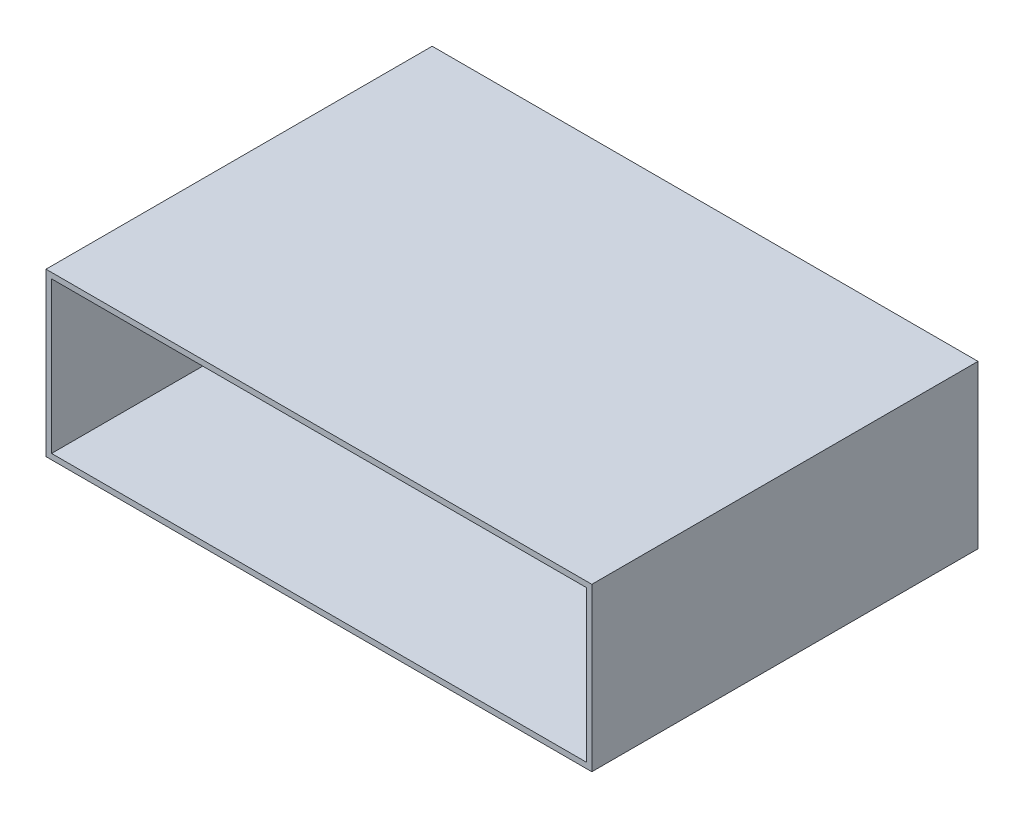
ISO-10303-21;
HEADER;
FILE_DESCRIPTION(('STEP AP214'),'2;1');
FILE_NAME('part.step','',(''),(''),'','','');
FILE_SCHEMA(('AUTOMOTIVE_DESIGN { 1 0 10303 214 1 1 1 1 }'));
ENDSEC;
DATA;
#1=APPLICATION_CONTEXT('core data for automotive mechanical design processes');
#2=APPLICATION_PROTOCOL_DEFINITION('international standard','automotive_design',2000,#1);
#3=PRODUCT_CONTEXT('',#1,'mechanical');
#4=PRODUCT('Part','Part','',(#3));
#5=PRODUCT_RELATED_PRODUCT_CATEGORY('part','',(#4));
#6=PRODUCT_DEFINITION_FORMATION('','',#4);
#7=PRODUCT_DEFINITION_CONTEXT('part definition',#1,'design');
#8=PRODUCT_DEFINITION('design','',#6,#7);
#9=PRODUCT_DEFINITION_SHAPE('','',#8);
#10=(LENGTH_UNIT() NAMED_UNIT(*) SI_UNIT(.MILLI.,.METRE.));
#11=(NAMED_UNIT(*) PLANE_ANGLE_UNIT() SI_UNIT($,.RADIAN.));
#12=(NAMED_UNIT(*) SI_UNIT($,.STERADIAN.) SOLID_ANGLE_UNIT());
#13=UNCERTAINTY_MEASURE_WITH_UNIT(LENGTH_MEASURE(1.E-05),#10,'distance_accuracy_value','');
#14=(GEOMETRIC_REPRESENTATION_CONTEXT(3) GLOBAL_UNCERTAINTY_ASSIGNED_CONTEXT((#13)) GLOBAL_UNIT_ASSIGNED_CONTEXT((#10,
#11,#12)) REPRESENTATION_CONTEXT('',''));
#15=CARTESIAN_POINT('',(0.,0.,0.));
#16=DIRECTION('',(0.,0.,1.));
#17=DIRECTION('',(1.,0.,0.));
#18=AXIS2_PLACEMENT_3D('',#15,#16,#17);
#19=CARTESIAN_POINT('',(0.,0.,219.9));
#20=DIRECTION('',(0.,0.,-1.));
#21=DIRECTION('',(-1.,0.,0.));
#22=AXIS2_PLACEMENT_3D('',#19,#20,#21);
#23=PLANE('',#22);
#24=DIRECTION('',(0.,1.,0.));
#25=VECTOR('',#24,1.);
#26=CARTESIAN_POINT('',(155.40625,-46.2275,219.9));
#27=LINE('',#26,#25);
#28=CARTESIAN_POINT('',(155.40625,-46.2275,219.9));
#29=VERTEX_POINT('',#28);
#30=CARTESIAN_POINT('',(155.40625,46.2275,219.9));
#31=VERTEX_POINT('',#30);
#32=EDGE_CURVE('E159',#29,#31,#27,.T.);
#33=ORIENTED_EDGE('',*,*,#32,.T.);
#34=DIRECTION('',(-1.,0.,0.));
#35=VECTOR('',#34,1.);
#36=CARTESIAN_POINT('',(-155.40625,46.2275,219.9));
#37=LINE('',#36,#35);
#38=CARTESIAN_POINT('',(-155.40625,46.2275,219.9));
#39=VERTEX_POINT('',#38);
#40=EDGE_CURVE('E163',#31,#39,#37,.T.);
#41=ORIENTED_EDGE('',*,*,#40,.T.);
#42=DIRECTION('',(0.,-1.,0.));
#43=VECTOR('',#42,1.);
#44=CARTESIAN_POINT('',(-155.40625,-46.2275,219.9));
#45=LINE('',#44,#43);
#46=CARTESIAN_POINT('',(-155.40625,-46.2275,219.9));
#47=VERTEX_POINT('',#46);
#48=EDGE_CURVE('E167',#39,#47,#45,.T.);
#49=ORIENTED_EDGE('',*,*,#48,.T.);
#50=DIRECTION('',(1.,0.,0.));
#51=VECTOR('',#50,1.);
#52=CARTESIAN_POINT('',(-155.40625,-46.2275,219.9));
#53=LINE('',#52,#51);
#54=EDGE_CURVE('E170',#47,#29,#53,.T.);
#55=ORIENTED_EDGE('',*,*,#54,.T.);
#56=EDGE_LOOP('',(#33,#41,#49,#55));
#57=FACE_BOUND('',#56,.T.);
#58=DIRECTION('',(0.,1.,0.));
#59=VECTOR('',#58,1.);
#60=CARTESIAN_POINT('',(152.23125,-43.0525,219.9));
#61=LINE('',#60,#59);
#62=CARTESIAN_POINT('',(152.23125,-43.0525,219.9));
#63=VERTEX_POINT('',#62);
#64=CARTESIAN_POINT('',(152.23125,43.0525,219.9));
#65=VERTEX_POINT('',#64);
#66=EDGE_CURVE('E139',#63,#65,#61,.T.);
#67=ORIENTED_EDGE('',*,*,#66,.F.);
#68=DIRECTION('',(1.,0.,0.));
#69=VECTOR('',#68,1.);
#70=CARTESIAN_POINT('',(-152.23125,-43.0525,219.9));
#71=LINE('',#70,#69);
#72=CARTESIAN_POINT('',(-152.23125,-43.0525,219.9));
#73=VERTEX_POINT('',#72);
#74=EDGE_CURVE('E118',#73,#63,#71,.T.);
#75=ORIENTED_EDGE('',*,*,#74,.F.);
#76=DIRECTION('',(0.,-1.,0.));
#77=VECTOR('',#76,1.);
#78=CARTESIAN_POINT('',(-152.23125,-43.0525,219.9));
#79=LINE('',#78,#77);
#80=CARTESIAN_POINT('',(-152.23125,43.0525,219.9));
#81=VERTEX_POINT('',#80);
#82=EDGE_CURVE('E145',#81,#73,#79,.T.);
#83=ORIENTED_EDGE('',*,*,#82,.F.);
#84=DIRECTION('',(-1.,0.,0.));
#85=VECTOR('',#84,1.);
#86=CARTESIAN_POINT('',(-152.23125,43.0525,219.9));
#87=LINE('',#86,#85);
#88=EDGE_CURVE('E142',#65,#81,#87,.T.);
#89=ORIENTED_EDGE('',*,*,#88,.F.);
#90=EDGE_LOOP('',(#67,#75,#83,#89));
#91=FACE_BOUND('',#90,.T.);
#92=ADVANCED_FACE('F44',(#57,#91),#23,.F.);
#93=CARTESIAN_POINT('',(0.,0.,0.));
#94=DIRECTION('',(0.,0.,-1.));
#95=DIRECTION('',(-1.,0.,0.));
#96=AXIS2_PLACEMENT_3D('',#93,#94,#95);
#97=PLANE('',#96);
#98=DIRECTION('',(0.,1.,0.));
#99=VECTOR('',#98,1.);
#100=CARTESIAN_POINT('',(155.40625,-46.2275,0.));
#101=LINE('',#100,#99);
#102=CARTESIAN_POINT('',(155.40625,-46.2275,0.));
#103=VERTEX_POINT('',#102);
#104=CARTESIAN_POINT('',(155.40625,46.2275,0.));
#105=VERTEX_POINT('',#104);
#106=EDGE_CURVE('E158',#103,#105,#101,.T.);
#107=ORIENTED_EDGE('',*,*,#106,.F.);
#108=DIRECTION('',(1.,0.,0.));
#109=VECTOR('',#108,1.);
#110=CARTESIAN_POINT('',(-155.40625,-46.2275,0.));
#111=LINE('',#110,#109);
#112=CARTESIAN_POINT('',(-155.40625,-46.2275,0.));
#113=VERTEX_POINT('',#112);
#114=EDGE_CURVE('E164',#113,#103,#111,.T.);
#115=ORIENTED_EDGE('',*,*,#114,.F.);
#116=DIRECTION('',(0.,-1.,0.));
#117=VECTOR('',#116,1.);
#118=CARTESIAN_POINT('',(-155.40625,-46.2275,0.));
#119=LINE('',#118,#117);
#120=CARTESIAN_POINT('',(-155.40625,46.2275,0.));
#121=VERTEX_POINT('',#120);
#122=EDGE_CURVE('E180',#121,#113,#119,.T.);
#123=ORIENTED_EDGE('',*,*,#122,.F.);
#124=DIRECTION('',(-1.,0.,0.));
#125=VECTOR('',#124,1.);
#126=CARTESIAN_POINT('',(-155.40625,46.2275,0.));
#127=LINE('',#126,#125);
#128=EDGE_CURVE('E177',#105,#121,#127,.T.);
#129=ORIENTED_EDGE('',*,*,#128,.F.);
#130=EDGE_LOOP('',(#107,#115,#123,#129));
#131=FACE_BOUND('',#130,.T.);
#132=ADVANCED_FACE('F203',(#131),#97,.T.);
#133=CARTESIAN_POINT('',(155.40625,-46.2275,219.9));
#134=DIRECTION('',(-1.,0.,0.));
#135=DIRECTION('',(0.,0.,1.));
#136=AXIS2_PLACEMENT_3D('',#133,#134,#135);
#137=PLANE('',#136);
#138=ORIENTED_EDGE('',*,*,#106,.T.);
#139=DIRECTION('',(0.,0.,-1.));
#140=VECTOR('',#139,1.);
#141=CARTESIAN_POINT('',(155.40625,46.2275,219.9));
#142=LINE('',#141,#140);
#143=EDGE_CURVE('E11',#31,#105,#142,.T.);
#144=ORIENTED_EDGE('',*,*,#143,.F.);
#145=ORIENTED_EDGE('',*,*,#32,.F.);
#146=DIRECTION('',(0.,0.,-1.));
#147=VECTOR('',#146,1.);
#148=CARTESIAN_POINT('',(155.40625,-46.2275,219.9));
#149=LINE('',#148,#147);
#150=EDGE_CURVE('E173',#29,#103,#149,.T.);
#151=ORIENTED_EDGE('',*,*,#150,.T.);
#152=EDGE_LOOP('',(#138,#144,#145,#151));
#153=FACE_BOUND('',#152,.T.);
#154=ADVANCED_FACE('F46',(#153),#137,.F.);
#155=CARTESIAN_POINT('',(-155.40625,46.2275,219.9));
#156=DIRECTION('',(0.,-1.,0.));
#157=DIRECTION('',(0.,0.,-1.));
#158=AXIS2_PLACEMENT_3D('',#155,#156,#157);
#159=PLANE('',#158);
#160=ORIENTED_EDGE('',*,*,#128,.T.);
#161=DIRECTION('',(0.,0.,-1.));
#162=VECTOR('',#161,1.);
#163=CARTESIAN_POINT('',(-155.40625,46.2275,219.9));
#164=LINE('',#163,#162);
#165=EDGE_CURVE('E53',#39,#121,#164,.T.);
#166=ORIENTED_EDGE('',*,*,#165,.F.);
#167=ORIENTED_EDGE('',*,*,#40,.F.);
#168=ORIENTED_EDGE('',*,*,#143,.T.);
#169=EDGE_LOOP('',(#160,#166,#167,#168));
#170=FACE_BOUND('',#169,.T.);
#171=ADVANCED_FACE('F213',(#170),#159,.F.);
#172=CARTESIAN_POINT('',(-155.40625,-46.2275,219.9));
#173=DIRECTION('',(1.,0.,0.));
#174=DIRECTION('',(0.,0.,-1.));
#175=AXIS2_PLACEMENT_3D('',#172,#173,#174);
#176=PLANE('',#175);
#177=ORIENTED_EDGE('',*,*,#122,.T.);
#178=DIRECTION('',(0.,0.,-1.));
#179=VECTOR('',#178,1.);
#180=CARTESIAN_POINT('',(-155.40625,-46.2275,219.9));
#181=LINE('',#180,#179);
#182=EDGE_CURVE('E188',#47,#113,#181,.T.);
#183=ORIENTED_EDGE('',*,*,#182,.F.);
#184=ORIENTED_EDGE('',*,*,#48,.F.);
#185=ORIENTED_EDGE('',*,*,#165,.T.);
#186=EDGE_LOOP('',(#177,#183,#184,#185));
#187=FACE_BOUND('',#186,.T.);
#188=ADVANCED_FACE('F197',(#187),#176,.F.);
#189=CARTESIAN_POINT('',(-155.40625,-46.2275,219.9));
#190=DIRECTION('',(0.,1.,0.));
#191=DIRECTION('',(0.,0.,1.));
#192=AXIS2_PLACEMENT_3D('',#189,#190,#191);
#193=PLANE('',#192);
#194=ORIENTED_EDGE('',*,*,#114,.T.);
#195=ORIENTED_EDGE('',*,*,#150,.F.);
#196=ORIENTED_EDGE('',*,*,#54,.F.);
#197=ORIENTED_EDGE('',*,*,#182,.T.);
#198=EDGE_LOOP('',(#194,#195,#196,#197));
#199=FACE_BOUND('',#198,.T.);
#200=ADVANCED_FACE('F206',(#199),#193,.F.);
#201=CARTESIAN_POINT('',(152.23125,-43.0525,219.9));
#202=DIRECTION('',(-1.,0.,0.));
#203=DIRECTION('',(0.,0.,1.));
#204=AXIS2_PLACEMENT_3D('',#201,#202,#203);
#205=PLANE('',#204);
#206=DIRECTION('',(0.,1.,0.));
#207=VECTOR('',#206,1.);
#208=CARTESIAN_POINT('',(152.23125,0.,3.175));
#209=LINE('',#208,#207);
#210=CARTESIAN_POINT('',(152.23125,-43.0525,3.175));
#211=VERTEX_POINT('',#210);
#212=CARTESIAN_POINT('',(152.23125,43.0525,3.17500000000001));
#213=VERTEX_POINT('',#212);
#214=EDGE_CURVE('E125',#211,#213,#209,.T.);
#215=ORIENTED_EDGE('',*,*,#214,.F.);
#216=DIRECTION('',(0.,0.,-1.));
#217=VECTOR('',#216,1.);
#218=CARTESIAN_POINT('',(152.23125,-43.0525,219.9));
#219=LINE('',#218,#217);
#220=EDGE_CURVE('E112',#63,#211,#219,.T.);
#221=ORIENTED_EDGE('',*,*,#220,.F.);
#222=ORIENTED_EDGE('',*,*,#66,.T.);
#223=DIRECTION('',(0.,0.,-1.));
#224=VECTOR('',#223,1.);
#225=CARTESIAN_POINT('',(152.23125,43.0525,219.9));
#226=LINE('',#225,#224);
#227=EDGE_CURVE('E127',#65,#213,#226,.T.);
#228=ORIENTED_EDGE('',*,*,#227,.T.);
#229=EDGE_LOOP('',(#215,#221,#222,#228));
#230=FACE_BOUND('',#229,.T.);
#231=ADVANCED_FACE('F126',(#230),#205,.T.);
#232=CARTESIAN_POINT('',(-152.23125,43.0525,219.9));
#233=DIRECTION('',(0.,-1.,0.));
#234=DIRECTION('',(0.,0.,-1.));
#235=AXIS2_PLACEMENT_3D('',#232,#233,#234);
#236=PLANE('',#235);
#237=DIRECTION('',(1.,0.,0.));
#238=VECTOR('',#237,1.);
#239=CARTESIAN_POINT('',(0.,43.0525,3.175));
#240=LINE('',#239,#238);
#241=CARTESIAN_POINT('',(-152.23125,43.0525,3.17500000000001));
#242=VERTEX_POINT('',#241);
#243=EDGE_CURVE('E60',#242,#213,#240,.T.);
#244=ORIENTED_EDGE('',*,*,#243,.T.);
#245=ORIENTED_EDGE('',*,*,#227,.F.);
#246=ORIENTED_EDGE('',*,*,#88,.T.);
#247=DIRECTION('',(0.,0.,-1.));
#248=VECTOR('',#247,1.);
#249=CARTESIAN_POINT('',(-152.23125,43.0525,219.9));
#250=LINE('',#249,#248);
#251=EDGE_CURVE('E153',#81,#242,#250,.T.);
#252=ORIENTED_EDGE('',*,*,#251,.T.);
#253=EDGE_LOOP('',(#244,#245,#246,#252));
#254=FACE_BOUND('',#253,.T.);
#255=ADVANCED_FACE('F233',(#254),#236,.T.);
#256=CARTESIAN_POINT('',(-152.23125,-43.0525,219.9));
#257=DIRECTION('',(1.,0.,0.));
#258=DIRECTION('',(0.,0.,-1.));
#259=AXIS2_PLACEMENT_3D('',#256,#257,#258);
#260=PLANE('',#259);
#261=DIRECTION('',(0.,1.,0.));
#262=VECTOR('',#261,1.);
#263=CARTESIAN_POINT('',(-152.23125,0.,3.175));
#264=LINE('',#263,#262);
#265=CARTESIAN_POINT('',(-152.23125,-43.0525,3.17500000000001));
#266=VERTEX_POINT('',#265);
#267=EDGE_CURVE('E68',#266,#242,#264,.T.);
#268=ORIENTED_EDGE('',*,*,#267,.T.);
#269=ORIENTED_EDGE('',*,*,#251,.F.);
#270=ORIENTED_EDGE('',*,*,#82,.T.);
#271=DIRECTION('',(0.,0.,-1.));
#272=VECTOR('',#271,1.);
#273=CARTESIAN_POINT('',(-152.23125,-43.0525,219.9));
#274=LINE('',#273,#272);
#275=EDGE_CURVE('E122',#73,#266,#274,.T.);
#276=ORIENTED_EDGE('',*,*,#275,.T.);
#277=EDGE_LOOP('',(#268,#269,#270,#276));
#278=FACE_BOUND('',#277,.T.);
#279=ADVANCED_FACE('F237',(#278),#260,.T.);
#280=CARTESIAN_POINT('',(-152.23125,-43.0525,219.9));
#281=DIRECTION('',(0.,1.,0.));
#282=DIRECTION('',(0.,0.,1.));
#283=AXIS2_PLACEMENT_3D('',#280,#281,#282);
#284=PLANE('',#283);
#285=DIRECTION('',(1.,0.,0.));
#286=VECTOR('',#285,1.);
#287=CARTESIAN_POINT('',(0.,-43.0525,3.175));
#288=LINE('',#287,#286);
#289=EDGE_CURVE('E116',#266,#211,#288,.T.);
#290=ORIENTED_EDGE('',*,*,#289,.F.);
#291=ORIENTED_EDGE('',*,*,#275,.F.);
#292=ORIENTED_EDGE('',*,*,#74,.T.);
#293=ORIENTED_EDGE('',*,*,#220,.T.);
#294=EDGE_LOOP('',(#290,#291,#292,#293));
#295=FACE_BOUND('',#294,.T.);
#296=ADVANCED_FACE('F114',(#295),#284,.T.);
#297=CARTESIAN_POINT('',(0.,0.,3.175));
#298=DIRECTION('',(0.,0.,1.));
#299=DIRECTION('',(1.,0.,0.));
#300=AXIS2_PLACEMENT_3D('',#297,#298,#299);
#301=PLANE('',#300);
#302=ORIENTED_EDGE('',*,*,#289,.T.);
#303=ORIENTED_EDGE('',*,*,#214,.T.);
#304=ORIENTED_EDGE('',*,*,#243,.F.);
#305=ORIENTED_EDGE('',*,*,#267,.F.);
#306=EDGE_LOOP('',(#302,#303,#304,#305));
#307=FACE_BOUND('',#306,.T.);
#308=ADVANCED_FACE('F131',(#307),#301,.T.);
#309=CLOSED_SHELL('',(#92,#132,#154,#171,#188,#200,#231,#255,#279,#296,#308));
#310=MANIFOLD_SOLID_BREP('B2',#309);
#311=ADVANCED_BREP_SHAPE_REPRESENTATION('',(#18,#310),#14);
#312=SHAPE_DEFINITION_REPRESENTATION(#9,#311);
ENDSEC;
END-ISO-10303-21;
